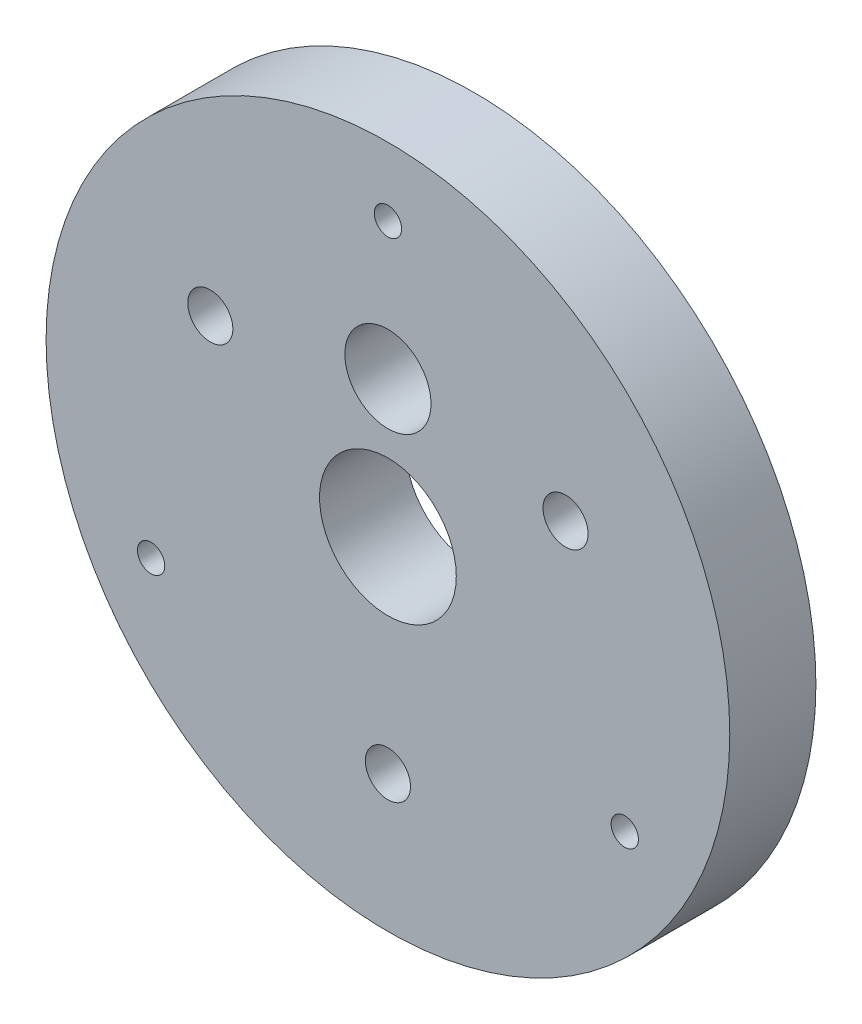
ISO-10303-21;
HEADER;
FILE_DESCRIPTION(('STEP AP214'),'2;1');
FILE_NAME('part.step','',(''),(''),'','','');
FILE_SCHEMA(('AUTOMOTIVE_DESIGN { 1 0 10303 214 1 1 1 1 }'));
ENDSEC;
DATA;
#1=APPLICATION_CONTEXT('core data for automotive mechanical design processes');
#2=APPLICATION_PROTOCOL_DEFINITION('international standard','automotive_design',2000,#1);
#3=PRODUCT_CONTEXT('',#1,'mechanical');
#4=PRODUCT('Part','Part','',(#3));
#5=PRODUCT_RELATED_PRODUCT_CATEGORY('part','',(#4));
#6=PRODUCT_DEFINITION_FORMATION('','',#4);
#7=PRODUCT_DEFINITION_CONTEXT('part definition',#1,'design');
#8=PRODUCT_DEFINITION('design','',#6,#7);
#9=PRODUCT_DEFINITION_SHAPE('','',#8);
#10=(LENGTH_UNIT() NAMED_UNIT(*) SI_UNIT(.MILLI.,.METRE.));
#11=(NAMED_UNIT(*) PLANE_ANGLE_UNIT() SI_UNIT($,.RADIAN.));
#12=(NAMED_UNIT(*) SI_UNIT($,.STERADIAN.) SOLID_ANGLE_UNIT());
#13=UNCERTAINTY_MEASURE_WITH_UNIT(LENGTH_MEASURE(1.E-05),#10,'distance_accuracy_value','');
#14=(GEOMETRIC_REPRESENTATION_CONTEXT(3) GLOBAL_UNCERTAINTY_ASSIGNED_CONTEXT((#13)) GLOBAL_UNIT_ASSIGNED_CONTEXT((#10,
#11,#12)) REPRESENTATION_CONTEXT('',''));
#15=CARTESIAN_POINT('',(0.,0.,0.));
#16=DIRECTION('',(0.,0.,1.));
#17=DIRECTION('',(1.,0.,0.));
#18=AXIS2_PLACEMENT_3D('',#15,#16,#17);
#19=CARTESIAN_POINT('',(0.,0.,6.3));
#20=DIRECTION('',(0.,0.,1.));
#21=DIRECTION('',(1.,0.,0.));
#22=AXIS2_PLACEMENT_3D('',#19,#20,#21);
#23=PLANE('',#22);
#24=CARTESIAN_POINT('',(12.9903810567666,7.50000000000004,6.3));
#25=DIRECTION('',(0.,0.,1.));
#26=DIRECTION('',(1.,0.,0.));
#27=AXIS2_PLACEMENT_3D('',#24,#25,#26);
#28=CIRCLE('',#27,1.65);
#29=CARTESIAN_POINT('',(14.6403810567666,7.50000000000004,6.3));
#30=VERTEX_POINT('',#29);
#31=EDGE_CURVE('E96',#30,#30,#28,.T.);
#32=ORIENTED_EDGE('',*,*,#31,.F.);
#33=EDGE_LOOP('',(#32));
#34=FACE_BOUND('',#33,.T.);
#35=CARTESIAN_POINT('',(17.3205080756888,-10.,6.3));
#36=DIRECTION('',(0.,0.,1.));
#37=DIRECTION('',(1.,0.,0.));
#38=AXIS2_PLACEMENT_3D('',#35,#36,#37);
#39=CIRCLE('',#38,1.);
#40=CARTESIAN_POINT('',(18.3205080756888,-10.,6.3));
#41=VERTEX_POINT('',#40);
#42=EDGE_CURVE('E80',#41,#41,#39,.T.);
#43=ORIENTED_EDGE('',*,*,#42,.F.);
#44=EDGE_LOOP('',(#43));
#45=FACE_BOUND('',#44,.T.);
#46=CARTESIAN_POINT('',(0.,10.,6.3));
#47=DIRECTION('',(0.,0.,1.));
#48=DIRECTION('',(1.,0.,0.));
#49=AXIS2_PLACEMENT_3D('',#46,#47,#48);
#50=CIRCLE('',#49,3.15);
#51=CARTESIAN_POINT('',(3.15,10.,6.3));
#52=VERTEX_POINT('',#51);
#53=EDGE_CURVE('E64',#52,#52,#50,.T.);
#54=ORIENTED_EDGE('',*,*,#53,.F.);
#55=EDGE_LOOP('',(#54));
#56=FACE_BOUND('',#55,.T.);
#57=CARTESIAN_POINT('',(0.,0.,6.3));
#58=DIRECTION('',(0.,0.,1.));
#59=DIRECTION('',(1.,0.,0.));
#60=AXIS2_PLACEMENT_3D('',#57,#58,#59);
#61=CIRCLE('',#60,5.);
#62=CARTESIAN_POINT('',(5.,0.,6.3));
#63=VERTEX_POINT('',#62);
#64=EDGE_CURVE('E50',#63,#63,#61,.T.);
#65=ORIENTED_EDGE('',*,*,#64,.F.);
#66=EDGE_LOOP('',(#65));
#67=FACE_BOUND('',#66,.T.);
#68=CARTESIAN_POINT('',(0.,0.,6.3));
#69=DIRECTION('',(0.,0.,1.));
#70=DIRECTION('',(1.,0.,0.));
#71=AXIS2_PLACEMENT_3D('',#68,#69,#70);
#72=CIRCLE('',#71,25.);
#73=CARTESIAN_POINT('',(25.,0.,6.3));
#74=VERTEX_POINT('',#73);
#75=EDGE_CURVE('E10',#74,#74,#72,.T.);
#76=ORIENTED_EDGE('',*,*,#75,.T.);
#77=EDGE_LOOP('',(#76));
#78=FACE_BOUND('',#77,.T.);
#79=CARTESIAN_POINT('',(0.,20.,6.3));
#80=DIRECTION('',(0.,0.,1.));
#81=DIRECTION('',(1.,0.,0.));
#82=AXIS2_PLACEMENT_3D('',#79,#80,#81);
#83=CIRCLE('',#82,1.);
#84=CARTESIAN_POINT('',(1.,20.,6.3));
#85=VERTEX_POINT('',#84);
#86=EDGE_CURVE('E56',#85,#85,#83,.T.);
#87=ORIENTED_EDGE('',*,*,#86,.F.);
#88=EDGE_LOOP('',(#87));
#89=FACE_BOUND('',#88,.T.);
#90=CARTESIAN_POINT('',(-12.9903810567666,7.49999999999997,6.3));
#91=DIRECTION('',(0.,0.,1.));
#92=DIRECTION('',(1.,0.,0.));
#93=AXIS2_PLACEMENT_3D('',#90,#91,#92);
#94=CIRCLE('',#93,1.65);
#95=CARTESIAN_POINT('',(-11.3403810567666,7.49999999999997,6.3));
#96=VERTEX_POINT('',#95);
#97=EDGE_CURVE('E72',#96,#96,#94,.T.);
#98=ORIENTED_EDGE('',*,*,#97,.F.);
#99=EDGE_LOOP('',(#98));
#100=FACE_BOUND('',#99,.T.);
#101=CARTESIAN_POINT('',(-17.3205080756888,-10.,6.3));
#102=DIRECTION('',(0.,0.,1.));
#103=DIRECTION('',(1.,0.,0.));
#104=AXIS2_PLACEMENT_3D('',#101,#102,#103);
#105=CIRCLE('',#104,0.999999999999998);
#106=CARTESIAN_POINT('',(-16.3205080756888,-10.,6.3));
#107=VERTEX_POINT('',#106);
#108=EDGE_CURVE('E88',#107,#107,#105,.T.);
#109=ORIENTED_EDGE('',*,*,#108,.F.);
#110=EDGE_LOOP('',(#109));
#111=FACE_BOUND('',#110,.T.);
#112=CARTESIAN_POINT('',(0.,-15.,6.3));
#113=DIRECTION('',(0.,0.,1.));
#114=DIRECTION('',(1.,0.,0.));
#115=AXIS2_PLACEMENT_3D('',#112,#113,#114);
#116=CIRCLE('',#115,1.65);
#117=CARTESIAN_POINT('',(1.65000000000005,-15.,6.3));
#118=VERTEX_POINT('',#117);
#119=EDGE_CURVE('E104',#118,#118,#116,.T.);
#120=ORIENTED_EDGE('',*,*,#119,.F.);
#121=EDGE_LOOP('',(#120));
#122=FACE_BOUND('',#121,.T.);
#123=ADVANCED_FACE('F37',(#34,#45,#56,#67,#78,#89,#100,#111,#122),#23,.T.);
#124=CARTESIAN_POINT('',(0.,0.,0.));
#125=DIRECTION('',(0.,0.,1.));
#126=DIRECTION('',(1.,0.,0.));
#127=AXIS2_PLACEMENT_3D('',#124,#125,#126);
#128=PLANE('',#127);
#129=CARTESIAN_POINT('',(0.,0.,0.));
#130=DIRECTION('',(0.,0.,1.));
#131=DIRECTION('',(1.,0.,0.));
#132=AXIS2_PLACEMENT_3D('',#129,#130,#131);
#133=CIRCLE('',#132,25.);
#134=CARTESIAN_POINT('',(25.,0.,0.));
#135=VERTEX_POINT('',#134);
#136=EDGE_CURVE('E41',#135,#135,#133,.T.);
#137=ORIENTED_EDGE('',*,*,#136,.F.);
#138=EDGE_LOOP('',(#137));
#139=FACE_BOUND('',#138,.T.);
#140=CARTESIAN_POINT('',(0.,0.,0.));
#141=DIRECTION('',(0.,0.,1.));
#142=DIRECTION('',(1.,0.,0.));
#143=AXIS2_PLACEMENT_3D('',#140,#141,#142);
#144=CIRCLE('',#143,5.);
#145=CARTESIAN_POINT('',(5.,0.,0.));
#146=VERTEX_POINT('',#145);
#147=EDGE_CURVE('E52',#146,#146,#144,.T.);
#148=ORIENTED_EDGE('',*,*,#147,.T.);
#149=EDGE_LOOP('',(#148));
#150=FACE_BOUND('',#149,.T.);
#151=CARTESIAN_POINT('',(0.,20.,0.));
#152=DIRECTION('',(0.,0.,1.));
#153=DIRECTION('',(1.,0.,0.));
#154=AXIS2_PLACEMENT_3D('',#151,#152,#153);
#155=CIRCLE('',#154,1.);
#156=CARTESIAN_POINT('',(1.,20.,0.));
#157=VERTEX_POINT('',#156);
#158=EDGE_CURVE('E60',#157,#157,#155,.T.);
#159=ORIENTED_EDGE('',*,*,#158,.T.);
#160=EDGE_LOOP('',(#159));
#161=FACE_BOUND('',#160,.T.);
#162=CARTESIAN_POINT('',(0.,10.,0.));
#163=DIRECTION('',(0.,0.,1.));
#164=DIRECTION('',(1.,0.,0.));
#165=AXIS2_PLACEMENT_3D('',#162,#163,#164);
#166=CIRCLE('',#165,3.15);
#167=CARTESIAN_POINT('',(3.15,10.,0.));
#168=VERTEX_POINT('',#167);
#169=EDGE_CURVE('E68',#168,#168,#166,.T.);
#170=ORIENTED_EDGE('',*,*,#169,.T.);
#171=EDGE_LOOP('',(#170));
#172=FACE_BOUND('',#171,.T.);
#173=CARTESIAN_POINT('',(-12.9903810567666,7.49999999999997,0.));
#174=DIRECTION('',(0.,0.,1.));
#175=DIRECTION('',(1.,0.,0.));
#176=AXIS2_PLACEMENT_3D('',#173,#174,#175);
#177=CIRCLE('',#176,1.65);
#178=CARTESIAN_POINT('',(-11.3403810567666,7.49999999999997,0.));
#179=VERTEX_POINT('',#178);
#180=EDGE_CURVE('E76',#179,#179,#177,.T.);
#181=ORIENTED_EDGE('',*,*,#180,.T.);
#182=EDGE_LOOP('',(#181));
#183=FACE_BOUND('',#182,.T.);
#184=CARTESIAN_POINT('',(17.3205080756888,-10.,0.));
#185=DIRECTION('',(0.,0.,1.));
#186=DIRECTION('',(1.,0.,0.));
#187=AXIS2_PLACEMENT_3D('',#184,#185,#186);
#188=CIRCLE('',#187,1.);
#189=CARTESIAN_POINT('',(18.3205080756888,-10.,0.));
#190=VERTEX_POINT('',#189);
#191=EDGE_CURVE('E84',#190,#190,#188,.T.);
#192=ORIENTED_EDGE('',*,*,#191,.T.);
#193=EDGE_LOOP('',(#192));
#194=FACE_BOUND('',#193,.T.);
#195=CARTESIAN_POINT('',(-17.3205080756888,-10.,0.));
#196=DIRECTION('',(0.,0.,1.));
#197=DIRECTION('',(1.,0.,0.));
#198=AXIS2_PLACEMENT_3D('',#195,#196,#197);
#199=CIRCLE('',#198,0.999999999999998);
#200=CARTESIAN_POINT('',(-16.3205080756888,-10.,0.));
#201=VERTEX_POINT('',#200);
#202=EDGE_CURVE('E92',#201,#201,#199,.T.);
#203=ORIENTED_EDGE('',*,*,#202,.T.);
#204=EDGE_LOOP('',(#203));
#205=FACE_BOUND('',#204,.T.);
#206=CARTESIAN_POINT('',(12.9903810567666,7.50000000000004,0.));
#207=DIRECTION('',(0.,0.,1.));
#208=DIRECTION('',(1.,0.,0.));
#209=AXIS2_PLACEMENT_3D('',#206,#207,#208);
#210=CIRCLE('',#209,1.65);
#211=CARTESIAN_POINT('',(14.6403810567666,7.50000000000004,0.));
#212=VERTEX_POINT('',#211);
#213=EDGE_CURVE('E100',#212,#212,#210,.T.);
#214=ORIENTED_EDGE('',*,*,#213,.T.);
#215=EDGE_LOOP('',(#214));
#216=FACE_BOUND('',#215,.T.);
#217=CARTESIAN_POINT('',(0.,-15.,0.));
#218=DIRECTION('',(0.,0.,1.));
#219=DIRECTION('',(1.,0.,0.));
#220=AXIS2_PLACEMENT_3D('',#217,#218,#219);
#221=CIRCLE('',#220,1.65);
#222=CARTESIAN_POINT('',(1.65000000000005,-15.,0.));
#223=VERTEX_POINT('',#222);
#224=EDGE_CURVE('E108',#223,#223,#221,.T.);
#225=ORIENTED_EDGE('',*,*,#224,.T.);
#226=EDGE_LOOP('',(#225));
#227=FACE_BOUND('',#226,.T.);
#228=ADVANCED_FACE('F120',(#139,#150,#161,#172,#183,#194,#205,#216,#227),#128,.F.);
#229=CARTESIAN_POINT('',(0.,0.,6.3));
#230=DIRECTION('',(0.,0.,-1.));
#231=DIRECTION('',(-1.,0.,0.));
#232=AXIS2_PLACEMENT_3D('',#229,#230,#231);
#233=CYLINDRICAL_SURFACE('',#232,25.);
#234=ORIENTED_EDGE('',*,*,#75,.F.);
#235=EDGE_LOOP('',(#234));
#236=FACE_BOUND('',#235,.T.);
#237=ORIENTED_EDGE('',*,*,#136,.T.);
#238=EDGE_LOOP('',(#237));
#239=FACE_BOUND('',#238,.T.);
#240=ADVANCED_FACE('F39',(#236,#239),#233,.T.);
#241=CARTESIAN_POINT('',(0.,0.,6.3));
#242=DIRECTION('',(0.,0.,-1.));
#243=DIRECTION('',(-1.,0.,0.));
#244=AXIS2_PLACEMENT_3D('',#241,#242,#243);
#245=CYLINDRICAL_SURFACE('',#244,5.);
#246=ORIENTED_EDGE('',*,*,#64,.T.);
#247=EDGE_LOOP('',(#246));
#248=FACE_BOUND('',#247,.T.);
#249=ORIENTED_EDGE('',*,*,#147,.F.);
#250=EDGE_LOOP('',(#249));
#251=FACE_BOUND('',#250,.T.);
#252=ADVANCED_FACE('F130',(#248,#251),#245,.F.);
#253=CARTESIAN_POINT('',(0.,20.,6.3));
#254=DIRECTION('',(0.,0.,-1.));
#255=DIRECTION('',(-1.,0.,0.));
#256=AXIS2_PLACEMENT_3D('',#253,#254,#255);
#257=CYLINDRICAL_SURFACE('',#256,1.);
#258=ORIENTED_EDGE('',*,*,#86,.T.);
#259=EDGE_LOOP('',(#258));
#260=FACE_BOUND('',#259,.T.);
#261=ORIENTED_EDGE('',*,*,#158,.F.);
#262=EDGE_LOOP('',(#261));
#263=FACE_BOUND('',#262,.T.);
#264=ADVANCED_FACE('F133',(#260,#263),#257,.F.);
#265=CARTESIAN_POINT('',(0.,10.,6.3));
#266=DIRECTION('',(0.,0.,-1.));
#267=DIRECTION('',(-1.,0.,0.));
#268=AXIS2_PLACEMENT_3D('',#265,#266,#267);
#269=CYLINDRICAL_SURFACE('',#268,3.15);
#270=ORIENTED_EDGE('',*,*,#53,.T.);
#271=EDGE_LOOP('',(#270));
#272=FACE_BOUND('',#271,.T.);
#273=ORIENTED_EDGE('',*,*,#169,.F.);
#274=EDGE_LOOP('',(#273));
#275=FACE_BOUND('',#274,.T.);
#276=ADVANCED_FACE('F137',(#272,#275),#269,.F.);
#277=CARTESIAN_POINT('',(-12.9903810567666,7.49999999999997,6.3));
#278=DIRECTION('',(0.,0.,-1.));
#279=DIRECTION('',(-1.,0.,0.));
#280=AXIS2_PLACEMENT_3D('',#277,#278,#279);
#281=CYLINDRICAL_SURFACE('',#280,1.65);
#282=ORIENTED_EDGE('',*,*,#97,.T.);
#283=EDGE_LOOP('',(#282));
#284=FACE_BOUND('',#283,.T.);
#285=ORIENTED_EDGE('',*,*,#180,.F.);
#286=EDGE_LOOP('',(#285));
#287=FACE_BOUND('',#286,.T.);
#288=ADVANCED_FACE('F141',(#284,#287),#281,.F.);
#289=CARTESIAN_POINT('',(17.3205080756888,-10.,6.3));
#290=DIRECTION('',(0.,0.,-1.));
#291=DIRECTION('',(-1.,0.,0.));
#292=AXIS2_PLACEMENT_3D('',#289,#290,#291);
#293=CYLINDRICAL_SURFACE('',#292,1.);
#294=ORIENTED_EDGE('',*,*,#42,.T.);
#295=EDGE_LOOP('',(#294));
#296=FACE_BOUND('',#295,.T.);
#297=ORIENTED_EDGE('',*,*,#191,.F.);
#298=EDGE_LOOP('',(#297));
#299=FACE_BOUND('',#298,.T.);
#300=ADVANCED_FACE('F145',(#296,#299),#293,.F.);
#301=CARTESIAN_POINT('',(-17.3205080756888,-10.,6.3));
#302=DIRECTION('',(0.,0.,-1.));
#303=DIRECTION('',(-1.,0.,0.));
#304=AXIS2_PLACEMENT_3D('',#301,#302,#303);
#305=CYLINDRICAL_SURFACE('',#304,0.999999999999998);
#306=ORIENTED_EDGE('',*,*,#108,.T.);
#307=EDGE_LOOP('',(#306));
#308=FACE_BOUND('',#307,.T.);
#309=ORIENTED_EDGE('',*,*,#202,.F.);
#310=EDGE_LOOP('',(#309));
#311=FACE_BOUND('',#310,.T.);
#312=ADVANCED_FACE('F149',(#308,#311),#305,.F.);
#313=CARTESIAN_POINT('',(12.9903810567666,7.50000000000004,6.3));
#314=DIRECTION('',(0.,0.,-1.));
#315=DIRECTION('',(-1.,0.,0.));
#316=AXIS2_PLACEMENT_3D('',#313,#314,#315);
#317=CYLINDRICAL_SURFACE('',#316,1.65);
#318=ORIENTED_EDGE('',*,*,#31,.T.);
#319=EDGE_LOOP('',(#318));
#320=FACE_BOUND('',#319,.T.);
#321=ORIENTED_EDGE('',*,*,#213,.F.);
#322=EDGE_LOOP('',(#321));
#323=FACE_BOUND('',#322,.T.);
#324=ADVANCED_FACE('F153',(#320,#323),#317,.F.);
#325=CARTESIAN_POINT('',(0.,-15.,6.3));
#326=DIRECTION('',(0.,0.,-1.));
#327=DIRECTION('',(-1.,0.,0.));
#328=AXIS2_PLACEMENT_3D('',#325,#326,#327);
#329=CYLINDRICAL_SURFACE('',#328,1.65);
#330=ORIENTED_EDGE('',*,*,#119,.T.);
#331=EDGE_LOOP('',(#330));
#332=FACE_BOUND('',#331,.T.);
#333=ORIENTED_EDGE('',*,*,#224,.F.);
#334=EDGE_LOOP('',(#333));
#335=FACE_BOUND('',#334,.T.);
#336=ADVANCED_FACE('F116',(#332,#335),#329,.F.);
#337=CLOSED_SHELL('',(#123,#228,#240,#252,#264,#276,#288,#300,#312,#324,#336));
#338=MANIFOLD_SOLID_BREP('B2',#337);
#339=ADVANCED_BREP_SHAPE_REPRESENTATION('',(#18,#338),#14);
#340=SHAPE_DEFINITION_REPRESENTATION(#9,#339);
ENDSEC;
END-ISO-10303-21;
